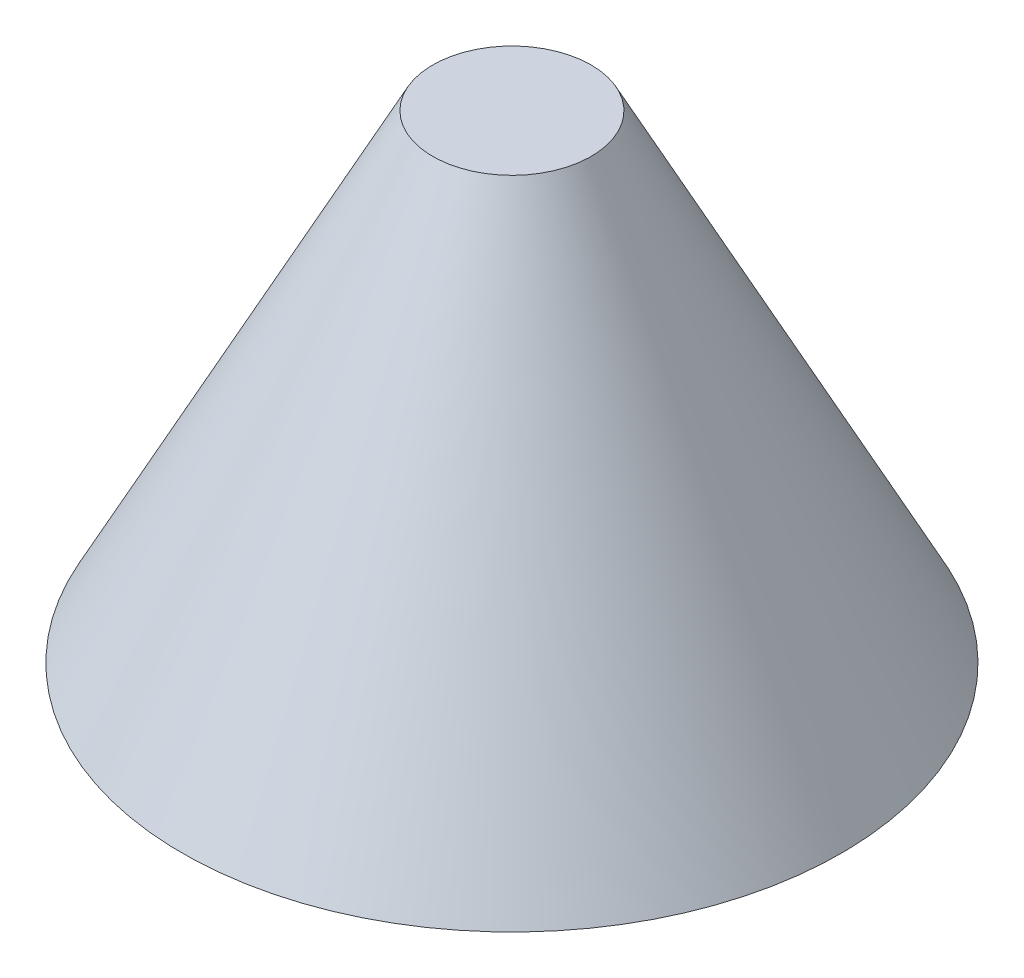
ISO-10303-21;
HEADER;
FILE_DESCRIPTION(('STEP AP214'),'2;1');
FILE_NAME('part.step','',(''),(''),'','','');
FILE_SCHEMA(('AUTOMOTIVE_DESIGN { 1 0 10303 214 1 1 1 1 }'));
ENDSEC;
DATA;
#1=APPLICATION_CONTEXT('core data for automotive mechanical design processes');
#2=APPLICATION_PROTOCOL_DEFINITION('international standard','automotive_design',2000,#1);
#3=PRODUCT_CONTEXT('',#1,'mechanical');
#4=PRODUCT('Part','Part','',(#3));
#5=PRODUCT_RELATED_PRODUCT_CATEGORY('part','',(#4));
#6=PRODUCT_DEFINITION_FORMATION('','',#4);
#7=PRODUCT_DEFINITION_CONTEXT('part definition',#1,'design');
#8=PRODUCT_DEFINITION('design','',#6,#7);
#9=PRODUCT_DEFINITION_SHAPE('','',#8);
#10=(LENGTH_UNIT() NAMED_UNIT(*) SI_UNIT(.MILLI.,.METRE.));
#11=(NAMED_UNIT(*) PLANE_ANGLE_UNIT() SI_UNIT($,.RADIAN.));
#12=(NAMED_UNIT(*) SI_UNIT($,.STERADIAN.) SOLID_ANGLE_UNIT());
#13=UNCERTAINTY_MEASURE_WITH_UNIT(LENGTH_MEASURE(1.E-05),#10,'distance_accuracy_value','');
#14=(GEOMETRIC_REPRESENTATION_CONTEXT(3) GLOBAL_UNCERTAINTY_ASSIGNED_CONTEXT((#13)) GLOBAL_UNIT_ASSIGNED_CONTEXT((#10,
#11,#12)) REPRESENTATION_CONTEXT('',''));
#15=CARTESIAN_POINT('',(0.,0.,0.));
#16=DIRECTION('',(0.,0.,1.));
#17=DIRECTION('',(1.,0.,0.));
#18=AXIS2_PLACEMENT_3D('',#15,#16,#17);
#19=CARTESIAN_POINT('',(0.,0.,0.));
#20=DIRECTION('',(0.,-1.,0.));
#21=DIRECTION('',(0.,0.,-1.));
#22=AXIS2_PLACEMENT_3D('',#19,#20,#21);
#23=PLANE('',#22);
#24=CARTESIAN_POINT('',(0.,0.,0.));
#25=DIRECTION('',(0.,-1.,0.));
#26=DIRECTION('',(0.,0.,-1.));
#27=AXIS2_PLACEMENT_3D('',#24,#25,#26);
#28=CIRCLE('',#27,0.2);
#29=CARTESIAN_POINT('',(0.,0.,-0.2));
#30=VERTEX_POINT('',#29);
#31=EDGE_CURVE('E10',#30,#30,#28,.T.);
#32=ORIENTED_EDGE('',*,*,#31,.T.);
#33=EDGE_LOOP('',(#32));
#34=FACE_BOUND('',#33,.T.);
#35=ADVANCED_FACE('F32',(#34),#23,.T.);
#36=CARTESIAN_POINT('',(0.,0.,0.));
#37=DIRECTION('',(0.,-1.,0.));
#38=DIRECTION('',(0.,0.,-1.));
#39=AXIS2_PLACEMENT_3D('',#36,#37,#38);
#40=CONICAL_SURFACE('',#39,0.2,0.482207889411095);
#41=CARTESIAN_POINT('',(0.,0.290239587684482,0.));
#42=DIRECTION('',(0.,-1.,0.));
#43=DIRECTION('',(0.,0.,-1.));
#44=AXIS2_PLACEMENT_3D('',#41,#42,#43);
#45=CIRCLE('',#44,0.0480826834632353);
#46=CARTESIAN_POINT('',(0.,0.290239587684482,-0.0480826834632353));
#47=VERTEX_POINT('',#46);
#48=EDGE_CURVE('E38',#47,#47,#45,.T.);
#49=CARTESIAN_POINT('',(0.,0.290239587684482,-0.0480826834632353));
#50=CARTESIAN_POINT('',(0.,0.287216258646102,-0.0496651555104932));
#51=CARTESIAN_POINT('',(0.,0.284192929607722,-0.0512476275577512));
#52=CARTESIAN_POINT('',(0.,0.278146271530962,-0.0544125716522671));
#53=CARTESIAN_POINT('',(0.,0.275122942492582,-0.0559950436995251));
#54=CARTESIAN_POINT('',(0.,0.269076284415822,-0.059159987794041));
#55=CARTESIAN_POINT('',(0.,0.266052955377442,-0.060742459841299));
#56=CARTESIAN_POINT('',(0.,0.260006297300682,-0.063907403935815));
#57=CARTESIAN_POINT('',(0.,0.256982968262302,-0.0654898759830729));
#58=CARTESIAN_POINT('',(0.,0.250936310185542,-0.0686548200775888));
#59=CARTESIAN_POINT('',(0.,0.247912981147162,-0.0702372921248468));
#60=CARTESIAN_POINT('',(0.,0.241866323070402,-0.0734022362193627));
#61=CARTESIAN_POINT('',(0.,0.238842994032022,-0.0749847082666207));
#62=CARTESIAN_POINT('',(0.,0.232796335955262,-0.0781496523611366));
#63=CARTESIAN_POINT('',(0.,0.229773006916882,-0.0797321244083946));
#64=CARTESIAN_POINT('',(0.,0.223726348840122,-0.0828970685029105));
#65=CARTESIAN_POINT('',(0.,0.220703019801742,-0.0844795405501685));
#66=CARTESIAN_POINT('',(0.,0.214656361724982,-0.0876444846446844));
#67=CARTESIAN_POINT('',(0.,0.211633032686602,-0.0892269566919424));
#68=CARTESIAN_POINT('',(0.,0.205586374609841,-0.0923919007864583));
#69=CARTESIAN_POINT('',(0.,0.202563045571461,-0.0939743728337163));
#70=CARTESIAN_POINT('',(0.,0.196516387494701,-0.0971393169282322));
#71=CARTESIAN_POINT('',(0.,0.193493058456321,-0.0987217889754902));
#72=CARTESIAN_POINT('',(0.,0.187446400379561,-0.101886733070006));
#73=CARTESIAN_POINT('',(0.,0.184423071341181,-0.103469205117264));
#74=CARTESIAN_POINT('',(0.,0.178376413264421,-0.10663414921178));
#75=CARTESIAN_POINT('',(0.,0.175353084226041,-0.108216621259038));
#76=CARTESIAN_POINT('',(0.,0.169306426149281,-0.111381565353554));
#77=CARTESIAN_POINT('',(0.,0.166283097110901,-0.112964037400812));
#78=CARTESIAN_POINT('',(0.,0.160236439034141,-0.116128981495328));
#79=CARTESIAN_POINT('',(0.,0.157213109995761,-0.117711453542586));
#80=CARTESIAN_POINT('',(0.,0.151166451919001,-0.120876397637102));
#81=CARTESIAN_POINT('',(0.,0.148143122880621,-0.12245886968436));
#82=CARTESIAN_POINT('',(0.,0.142096464803861,-0.125623813778876));
#83=CARTESIAN_POINT('',(0.,0.139073135765481,-0.127206285826134));
#84=CARTESIAN_POINT('',(0.,0.133026477688721,-0.13037122992065));
#85=CARTESIAN_POINT('',(0.,0.130003148650341,-0.131953701967907));
#86=CARTESIAN_POINT('',(0.,0.123956490573581,-0.135118646062423));
#87=CARTESIAN_POINT('',(0.,0.120933161535201,-0.136701118109681));
#88=CARTESIAN_POINT('',(0.,0.114886503458441,-0.139866062204197));
#89=CARTESIAN_POINT('',(0.,0.111863174420061,-0.141448534251455));
#90=CARTESIAN_POINT('',(0.,0.105816516343301,-0.144613478345971));
#91=CARTESIAN_POINT('',(0.,0.102793187304921,-0.146195950393229));
#92=CARTESIAN_POINT('',(0.,0.0967465292281607,-0.149360894487745));
#93=CARTESIAN_POINT('',(0.,0.0937232001897807,-0.150943366535003));
#94=CARTESIAN_POINT('',(0.,0.0876765421130206,-0.154108310629519));
#95=CARTESIAN_POINT('',(0.,0.0846532130746406,-0.155690782676777));
#96=CARTESIAN_POINT('',(0.,0.0786065549978806,-0.158855726771293));
#97=CARTESIAN_POINT('',(0.,0.0755832259595006,-0.160438198818551));
#98=CARTESIAN_POINT('',(0.,0.0695365678827405,-0.163603142913067));
#99=CARTESIAN_POINT('',(0.,0.0665132388443605,-0.165185614960325));
#100=CARTESIAN_POINT('',(0.,0.0604665807676004,-0.168350559054841));
#101=CARTESIAN_POINT('',(0.,0.0574432517292204,-0.169933031102099));
#102=CARTESIAN_POINT('',(0.,0.0513965936524604,-0.173097975196615));
#103=CARTESIAN_POINT('',(0.,0.0483732646140804,-0.174680447243873));
#104=CARTESIAN_POINT('',(0.,0.0423266065373203,-0.177845391338389));
#105=CARTESIAN_POINT('',(0.,0.0393032774989403,-0.179427863385646));
#106=CARTESIAN_POINT('',(0.,0.0332566194221802,-0.182592807480162));
#107=CARTESIAN_POINT('',(0.,0.0302332903838002,-0.18417527952742));
#108=CARTESIAN_POINT('',(0.,0.0241866323070402,-0.187340223621936));
#109=CARTESIAN_POINT('',(0.,0.0211633032686602,-0.188922695669194));
#110=CARTESIAN_POINT('',(0.,0.0151166451919001,-0.19208763976371));
#111=CARTESIAN_POINT('',(0.,0.0120933161535201,-0.193670111810968));
#112=CARTESIAN_POINT('',(0.,0.00604665807676005,-0.196835055905484));
#113=CARTESIAN_POINT('',(0.,0.00302332903838003,-0.198417527952742));
#114=CARTESIAN_POINT('',(0.,0.,-0.2));
#115=B_SPLINE_CURVE_WITH_KNOTS('',3,(#49,#50,#51,#52,#53,#54,#55,#56,#57,#58,#59,#60,#61,#62,
#63,#64,#65,#66,#67,#68,#69,#70,#71,#72,#73,#74,#75,#76,#77,#78,#79,#80,#81,#82,#83,#84,#85,#86,
#87,#88,#89,#90,#91,#92,#93,#94,#95,#96,#97,#98,#99,#100,#101,#102,#103,#104,#105,#106,#107,
#108,#109,#110,#111,#112,#113,#114),.UNSPECIFIED.,.F.,.F.,(4,2,2,2,2,2,2,2,2,2,2,2,2,2,2,2,2,2,
2,2,2,2,2,2,2,2,2,2,2,2,2,2,4),(0.,0.0102373153850012,0.0204746307700024,0.0307119461550036,
0.0409492615400048,0.051186576925006,0.0614238923100072,0.0716612076950084,0.0818985230800096,
0.0921358384650108,0.102373153850012,0.112610469235013,0.122847784620014,0.133085100005016,
0.143322415390017,0.153559730775018,0.163797046160019,0.17403436154502,0.184271676930022,
0.194508992315023,0.204746307700024,0.214983623085025,0.225220938470026,0.235458253855028,
0.245695569240029,0.25593288462503,0.266170200010031,0.276407515395032,0.286644830780033,
0.296882146165035,0.307119461550036,0.317356776935037,0.327594092320038),.UNSPECIFIED.);
#116=EDGE_CURVE('BSEAM44',#47,#30,#115,.T.);
#117=ORIENTED_EDGE('',*,*,#48,.T.);
#118=ORIENTED_EDGE('',*,*,#31,.F.);
#119=ORIENTED_EDGE('',*,*,#116,.T.);
#120=ORIENTED_EDGE('',*,*,#116,.F.);
#121=EDGE_LOOP('',(#117,#119,#118,#120));
#122=FACE_BOUND('',#121,.T.);
#123=ADVANCED_FACE('F44',(#122),#40,.T.);
#124=CARTESIAN_POINT('',(0.0480826834632353,0.290239587684482,0.));
#125=DIRECTION('',(0.,1.,0.));
#126=DIRECTION('',(0.,0.,1.));
#127=AXIS2_PLACEMENT_3D('',#124,#125,#126);
#128=PLANE('',#127);
#129=ORIENTED_EDGE('',*,*,#48,.F.);
#130=EDGE_LOOP('',(#129));
#131=FACE_BOUND('',#130,.T.);
#132=ADVANCED_FACE('F47',(#131),#128,.T.);
#133=CLOSED_SHELL('',(#35,#123,#132));
#134=MANIFOLD_SOLID_BREP('B2',#133);
#135=ADVANCED_BREP_SHAPE_REPRESENTATION('',(#18,#134),#14);
#136=SHAPE_DEFINITION_REPRESENTATION(#9,#135);
ENDSEC;
END-ISO-10303-21;
